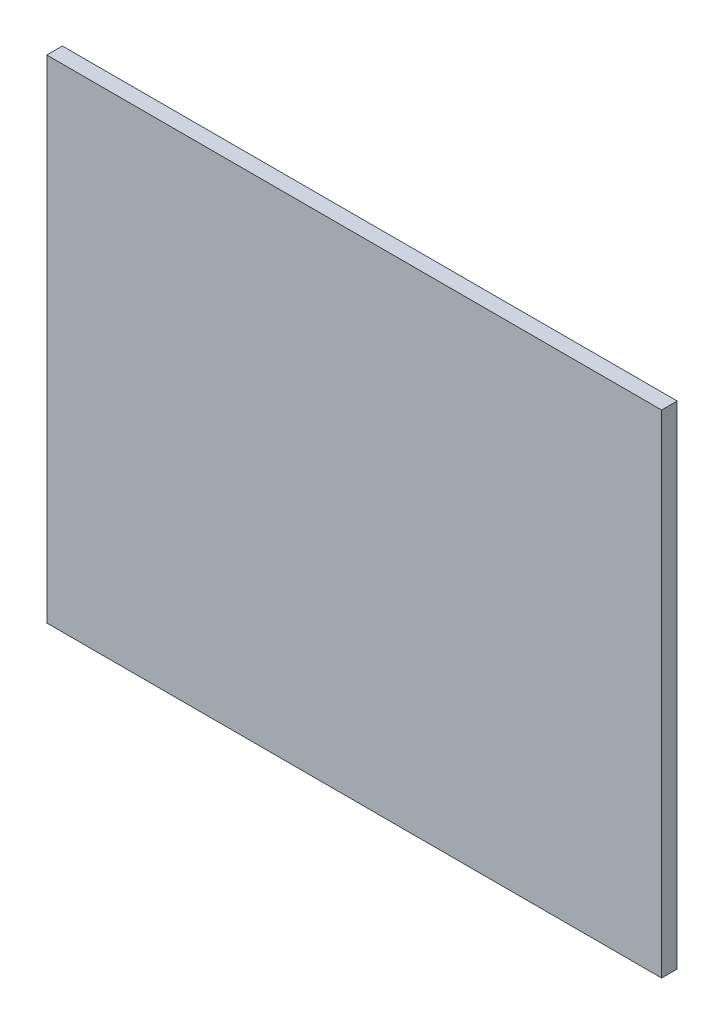
ISO-10303-21;
HEADER;
FILE_DESCRIPTION(('STEP AP214'),'2;1');
FILE_NAME('part.step','',(''),(''),'','','');
FILE_SCHEMA(('AUTOMOTIVE_DESIGN { 1 0 10303 214 1 1 1 1 }'));
ENDSEC;
DATA;
#1=APPLICATION_CONTEXT('core data for automotive mechanical design processes');
#2=APPLICATION_PROTOCOL_DEFINITION('international standard','automotive_design',2000,#1);
#3=PRODUCT_CONTEXT('',#1,'mechanical');
#4=PRODUCT('Part','Part','',(#3));
#5=PRODUCT_RELATED_PRODUCT_CATEGORY('part','',(#4));
#6=PRODUCT_DEFINITION_FORMATION('','',#4);
#7=PRODUCT_DEFINITION_CONTEXT('part definition',#1,'design');
#8=PRODUCT_DEFINITION('design','',#6,#7);
#9=PRODUCT_DEFINITION_SHAPE('','',#8);
#10=(LENGTH_UNIT() NAMED_UNIT(*) SI_UNIT(.MILLI.,.METRE.));
#11=(NAMED_UNIT(*) PLANE_ANGLE_UNIT() SI_UNIT($,.RADIAN.));
#12=(NAMED_UNIT(*) SI_UNIT($,.STERADIAN.) SOLID_ANGLE_UNIT());
#13=UNCERTAINTY_MEASURE_WITH_UNIT(LENGTH_MEASURE(1.E-05),#10,'distance_accuracy_value','');
#14=(GEOMETRIC_REPRESENTATION_CONTEXT(3) GLOBAL_UNCERTAINTY_ASSIGNED_CONTEXT((#13)) GLOBAL_UNIT_ASSIGNED_CONTEXT((#10,
#11,#12)) REPRESENTATION_CONTEXT('',''));
#15=CARTESIAN_POINT('',(0.,0.,0.));
#16=DIRECTION('',(0.,0.,1.));
#17=DIRECTION('',(1.,0.,0.));
#18=AXIS2_PLACEMENT_3D('',#15,#16,#17);
#19=CARTESIAN_POINT('',(-301.7943626744,154.841038020407,12.7));
#20=DIRECTION('',(1.,0.,0.));
#21=DIRECTION('',(0.,0.,-1.));
#22=AXIS2_PLACEMENT_3D('',#19,#20,#21);
#23=PLANE('',#22);
#24=DIRECTION('',(0.,-1.,0.));
#25=VECTOR('',#24,1.);
#26=CARTESIAN_POINT('',(-301.7943626744,154.841038020407,0.));
#27=LINE('',#26,#25);
#28=CARTESIAN_POINT('',(-301.7943626744,154.841038020407,0.));
#29=VERTEX_POINT('',#28);
#30=CARTESIAN_POINT('',(-301.7943626744,-245.158961979593,0.));
#31=VERTEX_POINT('',#30);
#32=EDGE_CURVE('E96',#29,#31,#27,.T.);
#33=ORIENTED_EDGE('',*,*,#32,.T.);
#34=DIRECTION('',(0.,0.,-1.));
#35=VECTOR('',#34,1.);
#36=CARTESIAN_POINT('',(-301.7943626744,-245.158961979593,12.7));
#37=LINE('',#36,#35);
#38=CARTESIAN_POINT('',(-301.7943626744,-245.158961979593,12.7));
#39=VERTEX_POINT('',#38);
#40=EDGE_CURVE('E11',#39,#31,#37,.T.);
#41=ORIENTED_EDGE('',*,*,#40,.F.);
#42=DIRECTION('',(0.,-1.,0.));
#43=VECTOR('',#42,1.);
#44=CARTESIAN_POINT('',(-301.7943626744,154.841038020407,12.7));
#45=LINE('',#44,#43);
#46=CARTESIAN_POINT('',(-301.7943626744,154.841038020407,12.7));
#47=VERTEX_POINT('',#46);
#48=EDGE_CURVE('E84',#47,#39,#45,.T.);
#49=ORIENTED_EDGE('',*,*,#48,.F.);
#50=DIRECTION('',(0.,0.,-1.));
#51=VECTOR('',#50,1.);
#52=CARTESIAN_POINT('',(-301.7943626744,154.841038020407,12.7));
#53=LINE('',#52,#51);
#54=EDGE_CURVE('E92',#47,#29,#53,.T.);
#55=ORIENTED_EDGE('',*,*,#54,.T.);
#56=EDGE_LOOP('',(#33,#41,#49,#55));
#57=FACE_BOUND('',#56,.T.);
#58=ADVANCED_FACE('F33',(#57),#23,.F.);
#59=CARTESIAN_POINT('',(-301.7943626744,-245.158961979593,12.7));
#60=DIRECTION('',(0.,1.,0.));
#61=DIRECTION('',(0.,0.,1.));
#62=AXIS2_PLACEMENT_3D('',#59,#60,#61);
#63=PLANE('',#62);
#64=DIRECTION('',(1.,0.,0.));
#65=VECTOR('',#64,1.);
#66=CARTESIAN_POINT('',(-301.7943626744,-245.158961979593,0.));
#67=LINE('',#66,#65);
#68=CARTESIAN_POINT('',(198.2056373256,-245.158961979593,0.));
#69=VERTEX_POINT('',#68);
#70=EDGE_CURVE('E88',#31,#69,#67,.T.);
#71=ORIENTED_EDGE('',*,*,#70,.T.);
#72=DIRECTION('',(0.,0.,-1.));
#73=VECTOR('',#72,1.);
#74=CARTESIAN_POINT('',(198.2056373256,-245.158961979593,12.7));
#75=LINE('',#74,#73);
#76=CARTESIAN_POINT('',(198.2056373256,-245.158961979593,12.7));
#77=VERTEX_POINT('',#76);
#78=EDGE_CURVE('E41',#77,#69,#75,.T.);
#79=ORIENTED_EDGE('',*,*,#78,.F.);
#80=DIRECTION('',(1.,0.,0.));
#81=VECTOR('',#80,1.);
#82=CARTESIAN_POINT('',(-301.7943626744,-245.158961979593,12.7));
#83=LINE('',#82,#81);
#84=EDGE_CURVE('E79',#39,#77,#83,.T.);
#85=ORIENTED_EDGE('',*,*,#84,.F.);
#86=ORIENTED_EDGE('',*,*,#40,.T.);
#87=EDGE_LOOP('',(#71,#79,#85,#86));
#88=FACE_BOUND('',#87,.T.);
#89=ADVANCED_FACE('F87',(#88),#63,.F.);
#90=CARTESIAN_POINT('',(198.2056373256,154.841038020407,12.7));
#91=DIRECTION('',(-1.,0.,0.));
#92=DIRECTION('',(0.,-1.,0.));
#93=AXIS2_PLACEMENT_3D('',#90,#91,#92);
#94=PLANE('',#93);
#95=DIRECTION('',(0.,1.,0.));
#96=VECTOR('',#95,1.);
#97=CARTESIAN_POINT('',(198.2056373256,154.841038020407,0.));
#98=LINE('',#97,#96);
#99=CARTESIAN_POINT('',(198.2056373256,154.841038020407,0.));
#100=VERTEX_POINT('',#99);
#101=EDGE_CURVE('E66',#69,#100,#98,.T.);
#102=ORIENTED_EDGE('',*,*,#101,.T.);
#103=DIRECTION('',(0.,0.,-1.));
#104=VECTOR('',#103,1.);
#105=CARTESIAN_POINT('',(198.2056373256,154.841038020407,12.7));
#106=LINE('',#105,#104);
#107=CARTESIAN_POINT('',(198.2056373256,154.841038020407,12.7));
#108=VERTEX_POINT('',#107);
#109=EDGE_CURVE('E89',#108,#100,#106,.T.);
#110=ORIENTED_EDGE('',*,*,#109,.F.);
#111=DIRECTION('',(0.,1.,0.));
#112=VECTOR('',#111,1.);
#113=CARTESIAN_POINT('',(198.2056373256,154.841038020407,12.7));
#114=LINE('',#113,#112);
#115=EDGE_CURVE('E82',#77,#108,#114,.T.);
#116=ORIENTED_EDGE('',*,*,#115,.F.);
#117=ORIENTED_EDGE('',*,*,#78,.T.);
#118=EDGE_LOOP('',(#102,#110,#116,#117));
#119=FACE_BOUND('',#118,.T.);
#120=ADVANCED_FACE('F90',(#119),#94,.F.);
#121=CARTESIAN_POINT('',(-301.7943626744,154.841038020407,12.7));
#122=DIRECTION('',(0.,-1.,0.));
#123=DIRECTION('',(0.,0.,-1.));
#124=AXIS2_PLACEMENT_3D('',#121,#122,#123);
#125=PLANE('',#124);
#126=DIRECTION('',(-1.,0.,0.));
#127=VECTOR('',#126,1.);
#128=CARTESIAN_POINT('',(-301.7943626744,154.841038020407,0.));
#129=LINE('',#128,#127);
#130=EDGE_CURVE('E72',#100,#29,#129,.T.);
#131=ORIENTED_EDGE('',*,*,#130,.T.);
#132=ORIENTED_EDGE('',*,*,#54,.F.);
#133=DIRECTION('',(-1.,0.,0.));
#134=VECTOR('',#133,1.);
#135=CARTESIAN_POINT('',(-301.7943626744,154.841038020407,12.7));
#136=LINE('',#135,#134);
#137=EDGE_CURVE('E49',#108,#47,#136,.T.);
#138=ORIENTED_EDGE('',*,*,#137,.F.);
#139=ORIENTED_EDGE('',*,*,#109,.T.);
#140=EDGE_LOOP('',(#131,#132,#138,#139));
#141=FACE_BOUND('',#140,.T.);
#142=ADVANCED_FACE('F103',(#141),#125,.F.);
#143=CARTESIAN_POINT('',(0.,0.,12.7));
#144=DIRECTION('',(0.,0.,1.));
#145=DIRECTION('',(1.,0.,0.));
#146=AXIS2_PLACEMENT_3D('',#143,#144,#145);
#147=PLANE('',#146);
#148=ORIENTED_EDGE('',*,*,#48,.T.);
#149=ORIENTED_EDGE('',*,*,#84,.T.);
#150=ORIENTED_EDGE('',*,*,#115,.T.);
#151=ORIENTED_EDGE('',*,*,#137,.T.);
#152=EDGE_LOOP('',(#148,#149,#150,#151));
#153=FACE_BOUND('',#152,.T.);
#154=ADVANCED_FACE('F80',(#153),#147,.T.);
#155=CARTESIAN_POINT('',(0.,0.,0.));
#156=DIRECTION('',(0.,0.,1.));
#157=DIRECTION('',(1.,0.,0.));
#158=AXIS2_PLACEMENT_3D('',#155,#156,#157);
#159=PLANE('',#158);
#160=ORIENTED_EDGE('',*,*,#32,.F.);
#161=ORIENTED_EDGE('',*,*,#130,.F.);
#162=ORIENTED_EDGE('',*,*,#101,.F.);
#163=ORIENTED_EDGE('',*,*,#70,.F.);
#164=EDGE_LOOP('',(#160,#161,#162,#163));
#165=FACE_BOUND('',#164,.T.);
#166=ADVANCED_FACE('F106',(#165),#159,.F.);
#167=CLOSED_SHELL('',(#58,#89,#120,#142,#154,#166));
#168=MANIFOLD_SOLID_BREP('B2',#167);
#169=ADVANCED_BREP_SHAPE_REPRESENTATION('',(#18,#168),#14);
#170=SHAPE_DEFINITION_REPRESENTATION(#9,#169);
ENDSEC;
END-ISO-10303-21;
